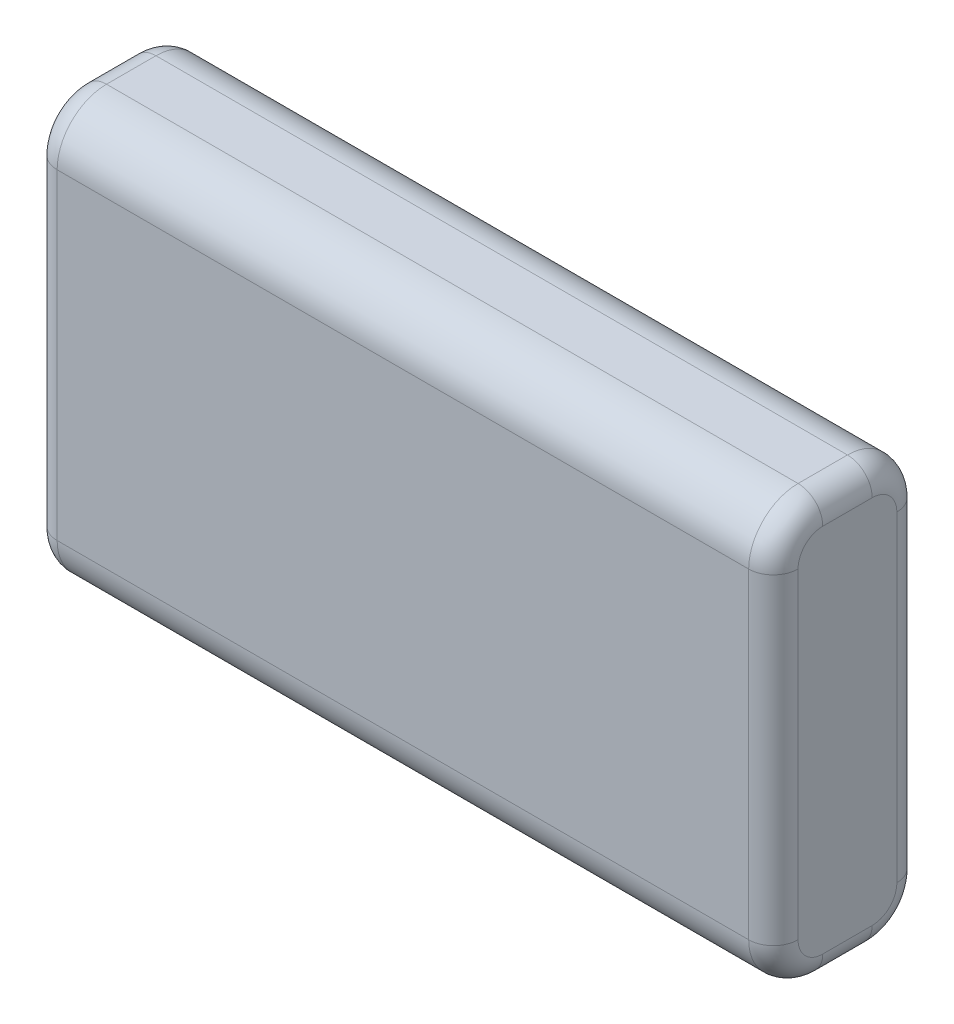
ISO-10303-21;
HEADER;
FILE_DESCRIPTION(('STEP AP214'),'2;1');
FILE_NAME('part.step','',(''),(''),'','','');
FILE_SCHEMA(('AUTOMOTIVE_DESIGN { 1 0 10303 214 1 1 1 1 }'));
ENDSEC;
DATA;
#1=APPLICATION_CONTEXT('core data for automotive mechanical design processes');
#2=APPLICATION_PROTOCOL_DEFINITION('international standard','automotive_design',2000,#1);
#3=PRODUCT_CONTEXT('',#1,'mechanical');
#4=PRODUCT('Part','Part','',(#3));
#5=PRODUCT_RELATED_PRODUCT_CATEGORY('part','',(#4));
#6=PRODUCT_DEFINITION_FORMATION('','',#4);
#7=PRODUCT_DEFINITION_CONTEXT('part definition',#1,'design');
#8=PRODUCT_DEFINITION('design','',#6,#7);
#9=PRODUCT_DEFINITION_SHAPE('','',#8);
#10=(LENGTH_UNIT() NAMED_UNIT(*) SI_UNIT(.MILLI.,.METRE.));
#11=(NAMED_UNIT(*) PLANE_ANGLE_UNIT() SI_UNIT($,.RADIAN.));
#12=(NAMED_UNIT(*) SI_UNIT($,.STERADIAN.) SOLID_ANGLE_UNIT());
#13=UNCERTAINTY_MEASURE_WITH_UNIT(LENGTH_MEASURE(1.E-05),#10,'distance_accuracy_value','');
#14=(GEOMETRIC_REPRESENTATION_CONTEXT(3) GLOBAL_UNCERTAINTY_ASSIGNED_CONTEXT((#13)) GLOBAL_UNIT_ASSIGNED_CONTEXT((#10,
#11,#12)) REPRESENTATION_CONTEXT('',''));
#15=CARTESIAN_POINT('',(0.,0.,0.));
#16=DIRECTION('',(0.,0.,1.));
#17=DIRECTION('',(1.,0.,0.));
#18=AXIS2_PLACEMENT_3D('',#15,#16,#17);
#19=CARTESIAN_POINT('',(0.,0.,6.));
#20=DIRECTION('',(1.,0.,0.));
#21=DIRECTION('',(0.,0.,-1.));
#22=AXIS2_PLACEMENT_3D('',#19,#20,#21);
#23=PLANE('',#22);
#24=DIRECTION('',(0.,-1.,0.));
#25=VECTOR('',#24,1.);
#26=CARTESIAN_POINT('',(0.,0.,5.));
#27=LINE('',#26,#25);
#28=CARTESIAN_POINT('',(0.,2.,5.));
#29=VERTEX_POINT('',#28);
#30=CARTESIAN_POINT('',(0.,15.,5.));
#31=VERTEX_POINT('',#30);
#32=EDGE_CURVE('E155',#29,#31,#27,.F.);
#33=ORIENTED_EDGE('',*,*,#32,.T.);
#34=CARTESIAN_POINT('',(0.,15.,4.));
#35=DIRECTION('',(1.,0.,0.));
#36=DIRECTION('',(0.,0.,-1.));
#37=AXIS2_PLACEMENT_3D('',#34,#35,#36);
#38=CIRCLE('',#37,1.);
#39=CARTESIAN_POINT('',(0.,16.,4.));
#40=VERTEX_POINT('',#39);
#41=EDGE_CURVE('E192',#31,#40,#38,.F.);
#42=ORIENTED_EDGE('',*,*,#41,.T.);
#43=DIRECTION('',(0.,0.,-1.));
#44=VECTOR('',#43,1.);
#45=CARTESIAN_POINT('',(0.,16.,6.));
#46=LINE('',#45,#44);
#47=CARTESIAN_POINT('',(0.,16.,2.));
#48=VERTEX_POINT('',#47);
#49=EDGE_CURVE('E190',#40,#48,#46,.T.);
#50=ORIENTED_EDGE('',*,*,#49,.T.);
#51=CARTESIAN_POINT('',(0.,15.,2.));
#52=DIRECTION('',(1.,0.,0.));
#53=DIRECTION('',(0.,0.,-1.));
#54=AXIS2_PLACEMENT_3D('',#51,#52,#53);
#55=CIRCLE('',#54,1.);
#56=CARTESIAN_POINT('',(0.,15.,1.));
#57=VERTEX_POINT('',#56);
#58=EDGE_CURVE('E188',#48,#57,#55,.F.);
#59=ORIENTED_EDGE('',*,*,#58,.T.);
#60=DIRECTION('',(0.,-1.,0.));
#61=VECTOR('',#60,1.);
#62=CARTESIAN_POINT('',(0.,2.,1.));
#63=LINE('',#62,#61);
#64=CARTESIAN_POINT('',(0.,2.,1.));
#65=VERTEX_POINT('',#64);
#66=EDGE_CURVE('E186',#57,#65,#63,.T.);
#67=ORIENTED_EDGE('',*,*,#66,.T.);
#68=CARTESIAN_POINT('',(0.,2.,2.));
#69=DIRECTION('',(1.,0.,0.));
#70=DIRECTION('',(0.,0.,-1.));
#71=AXIS2_PLACEMENT_3D('',#68,#69,#70);
#72=CIRCLE('',#71,1.);
#73=CARTESIAN_POINT('',(0.,1.,2.));
#74=VERTEX_POINT('',#73);
#75=EDGE_CURVE('E184',#65,#74,#72,.F.);
#76=ORIENTED_EDGE('',*,*,#75,.T.);
#77=DIRECTION('',(0.,0.,-1.));
#78=VECTOR('',#77,1.);
#79=CARTESIAN_POINT('',(0.,1.,6.));
#80=LINE('',#79,#78);
#81=CARTESIAN_POINT('',(0.,1.,4.));
#82=VERTEX_POINT('',#81);
#83=EDGE_CURVE('E158',#74,#82,#80,.F.);
#84=ORIENTED_EDGE('',*,*,#83,.T.);
#85=CARTESIAN_POINT('',(0.,2.,4.));
#86=DIRECTION('',(1.,0.,0.));
#87=DIRECTION('',(0.,0.,-1.));
#88=AXIS2_PLACEMENT_3D('',#85,#86,#87);
#89=CIRCLE('',#88,1.);
#90=EDGE_CURVE('E151',#82,#29,#89,.F.);
#91=ORIENTED_EDGE('',*,*,#90,.T.);
#92=EDGE_LOOP('',(#33,#42,#50,#59,#67,#76,#84,#91));
#93=FACE_BOUND('',#92,.T.);
#94=ADVANCED_FACE('F36',(#93),#23,.F.);
#95=CARTESIAN_POINT('',(0.,0.,6.));
#96=DIRECTION('',(0.,1.,0.));
#97=DIRECTION('',(0.,0.,1.));
#98=AXIS2_PLACEMENT_3D('',#95,#96,#97);
#99=PLANE('',#98);
#100=DIRECTION('',(1.,0.,0.));
#101=VECTOR('',#100,1.);
#102=CARTESIAN_POINT('',(0.,0.,4.));
#103=LINE('',#102,#101);
#104=CARTESIAN_POINT('',(29.,0.,4.));
#105=VERTEX_POINT('',#104);
#106=CARTESIAN_POINT('',(1.,0.,4.));
#107=VERTEX_POINT('',#106);
#108=EDGE_CURVE('E254',#105,#107,#103,.F.);
#109=ORIENTED_EDGE('',*,*,#108,.T.);
#110=DIRECTION('',(0.,0.,-1.));
#111=VECTOR('',#110,1.);
#112=CARTESIAN_POINT('',(1.,0.,6.));
#113=LINE('',#112,#111);
#114=CARTESIAN_POINT('',(1.,0.,2.));
#115=VERTEX_POINT('',#114);
#116=EDGE_CURVE('E217',#107,#115,#113,.T.);
#117=ORIENTED_EDGE('',*,*,#116,.T.);
#118=DIRECTION('',(1.,0.,0.));
#119=VECTOR('',#118,1.);
#120=CARTESIAN_POINT('',(30.,0.,2.));
#121=LINE('',#120,#119);
#122=CARTESIAN_POINT('',(29.,0.,2.));
#123=VERTEX_POINT('',#122);
#124=EDGE_CURVE('E299',#115,#123,#121,.T.);
#125=ORIENTED_EDGE('',*,*,#124,.T.);
#126=DIRECTION('',(0.,0.,-1.));
#127=VECTOR('',#126,1.);
#128=CARTESIAN_POINT('',(29.,0.,6.));
#129=LINE('',#128,#127);
#130=EDGE_CURVE('E215',#123,#105,#129,.F.);
#131=ORIENTED_EDGE('',*,*,#130,.T.);
#132=EDGE_LOOP('',(#109,#117,#125,#131));
#133=FACE_BOUND('',#132,.T.);
#134=ADVANCED_FACE('F365',(#133),#99,.F.);
#135=CARTESIAN_POINT('',(30.,0.,6.));
#136=DIRECTION('',(-1.,0.,0.));
#137=DIRECTION('',(0.,0.,1.));
#138=AXIS2_PLACEMENT_3D('',#135,#136,#137);
#139=PLANE('',#138);
#140=DIRECTION('',(0.,1.,0.));
#141=VECTOR('',#140,1.);
#142=CARTESIAN_POINT('',(30.,0.,5.));
#143=LINE('',#142,#141);
#144=CARTESIAN_POINT('',(30.,15.,5.));
#145=VERTEX_POINT('',#144);
#146=CARTESIAN_POINT('',(30.,2.,5.));
#147=VERTEX_POINT('',#146);
#148=EDGE_CURVE('E223',#145,#147,#143,.F.);
#149=ORIENTED_EDGE('',*,*,#148,.T.);
#150=CARTESIAN_POINT('',(30.,2.,4.));
#151=DIRECTION('',(-1.,0.,0.));
#152=DIRECTION('',(0.,0.,1.));
#153=AXIS2_PLACEMENT_3D('',#150,#151,#152);
#154=CIRCLE('',#153,1.);
#155=CARTESIAN_POINT('',(30.,1.,4.));
#156=VERTEX_POINT('',#155);
#157=EDGE_CURVE('E236',#147,#156,#154,.F.);
#158=ORIENTED_EDGE('',*,*,#157,.T.);
#159=DIRECTION('',(0.,0.,-1.));
#160=VECTOR('',#159,1.);
#161=CARTESIAN_POINT('',(30.,1.,6.));
#162=LINE('',#161,#160);
#163=CARTESIAN_POINT('',(30.,1.,2.));
#164=VERTEX_POINT('',#163);
#165=EDGE_CURVE('E60',#156,#164,#162,.T.);
#166=ORIENTED_EDGE('',*,*,#165,.T.);
#167=CARTESIAN_POINT('',(30.,2.,2.));
#168=DIRECTION('',(-1.,0.,0.));
#169=DIRECTION('',(0.,0.,1.));
#170=AXIS2_PLACEMENT_3D('',#167,#168,#169);
#171=CIRCLE('',#170,1.);
#172=CARTESIAN_POINT('',(30.,2.,1.));
#173=VERTEX_POINT('',#172);
#174=EDGE_CURVE('E233',#164,#173,#171,.F.);
#175=ORIENTED_EDGE('',*,*,#174,.T.);
#176=DIRECTION('',(0.,1.,0.));
#177=VECTOR('',#176,1.);
#178=CARTESIAN_POINT('',(30.,15.,1.));
#179=LINE('',#178,#177);
#180=CARTESIAN_POINT('',(30.,15.,1.));
#181=VERTEX_POINT('',#180);
#182=EDGE_CURVE('E231',#173,#181,#179,.T.);
#183=ORIENTED_EDGE('',*,*,#182,.T.);
#184=CARTESIAN_POINT('',(30.,15.,2.));
#185=DIRECTION('',(-1.,0.,0.));
#186=DIRECTION('',(0.,0.,1.));
#187=AXIS2_PLACEMENT_3D('',#184,#185,#186);
#188=CIRCLE('',#187,1.);
#189=CARTESIAN_POINT('',(30.,16.,2.));
#190=VERTEX_POINT('',#189);
#191=EDGE_CURVE('E229',#181,#190,#188,.F.);
#192=ORIENTED_EDGE('',*,*,#191,.T.);
#193=DIRECTION('',(0.,0.,-1.));
#194=VECTOR('',#193,1.);
#195=CARTESIAN_POINT('',(30.,16.,6.));
#196=LINE('',#195,#194);
#197=CARTESIAN_POINT('',(30.,16.,4.));
#198=VERTEX_POINT('',#197);
#199=EDGE_CURVE('E227',#190,#198,#196,.F.);
#200=ORIENTED_EDGE('',*,*,#199,.T.);
#201=CARTESIAN_POINT('',(30.,15.,4.));
#202=DIRECTION('',(-1.,0.,0.));
#203=DIRECTION('',(0.,0.,1.));
#204=AXIS2_PLACEMENT_3D('',#201,#202,#203);
#205=CIRCLE('',#204,1.);
#206=EDGE_CURVE('E225',#198,#145,#205,.F.);
#207=ORIENTED_EDGE('',*,*,#206,.T.);
#208=EDGE_LOOP('',(#149,#158,#166,#175,#183,#192,#200,#207));
#209=FACE_BOUND('',#208,.T.);
#210=ADVANCED_FACE('F349',(#209),#139,.F.);
#211=CARTESIAN_POINT('',(0.,17.,6.));
#212=DIRECTION('',(0.,-1.,0.));
#213=DIRECTION('',(0.,0.,-1.));
#214=AXIS2_PLACEMENT_3D('',#211,#212,#213);
#215=PLANE('',#214);
#216=DIRECTION('',(-1.,0.,0.));
#217=VECTOR('',#216,1.);
#218=CARTESIAN_POINT('',(0.,17.,2.));
#219=LINE('',#218,#217);
#220=CARTESIAN_POINT('',(29.,17.,2.));
#221=VERTEX_POINT('',#220);
#222=CARTESIAN_POINT('',(1.,17.,2.));
#223=VERTEX_POINT('',#222);
#224=EDGE_CURVE('E179',#221,#223,#219,.T.);
#225=ORIENTED_EDGE('',*,*,#224,.T.);
#226=DIRECTION('',(0.,0.,-1.));
#227=VECTOR('',#226,1.);
#228=CARTESIAN_POINT('',(1.,17.,6.));
#229=LINE('',#228,#227);
#230=CARTESIAN_POINT('',(1.,17.,4.));
#231=VERTEX_POINT('',#230);
#232=EDGE_CURVE('E201',#223,#231,#229,.F.);
#233=ORIENTED_EDGE('',*,*,#232,.T.);
#234=DIRECTION('',(-1.,0.,0.));
#235=VECTOR('',#234,1.);
#236=CARTESIAN_POINT('',(0.,17.,4.));
#237=LINE('',#236,#235);
#238=CARTESIAN_POINT('',(29.,17.,4.));
#239=VERTEX_POINT('',#238);
#240=EDGE_CURVE('E176',#231,#239,#237,.F.);
#241=ORIENTED_EDGE('',*,*,#240,.T.);
#242=DIRECTION('',(0.,0.,-1.));
#243=VECTOR('',#242,1.);
#244=CARTESIAN_POINT('',(29.,17.,6.));
#245=LINE('',#244,#243);
#246=EDGE_CURVE('E199',#239,#221,#245,.T.);
#247=ORIENTED_EDGE('',*,*,#246,.T.);
#248=EDGE_LOOP('',(#225,#233,#241,#247));
#249=FACE_BOUND('',#248,.T.);
#250=ADVANCED_FACE('F313',(#249),#215,.F.);
#251=CARTESIAN_POINT('',(0.,0.,6.));
#252=DIRECTION('',(0.,0.,-1.));
#253=DIRECTION('',(-1.,0.,0.));
#254=AXIS2_PLACEMENT_3D('',#251,#252,#253);
#255=PLANE('',#254);
#256=DIRECTION('',(-1.,0.,0.));
#257=VECTOR('',#256,1.);
#258=CARTESIAN_POINT('',(0.,15.,6.));
#259=LINE('',#258,#257);
#260=CARTESIAN_POINT('',(29.,15.,6.));
#261=VERTEX_POINT('',#260);
#262=CARTESIAN_POINT('',(1.,15.,6.));
#263=VERTEX_POINT('',#262);
#264=EDGE_CURVE('E301',#261,#263,#259,.T.);
#265=ORIENTED_EDGE('',*,*,#264,.T.);
#266=DIRECTION('',(0.,-1.,0.));
#267=VECTOR('',#266,1.);
#268=CARTESIAN_POINT('',(1.,0.,6.));
#269=LINE('',#268,#267);
#270=CARTESIAN_POINT('',(1.,2.,6.));
#271=VERTEX_POINT('',#270);
#272=EDGE_CURVE('E11',#263,#271,#269,.T.);
#273=ORIENTED_EDGE('',*,*,#272,.T.);
#274=DIRECTION('',(1.,0.,0.));
#275=VECTOR('',#274,1.);
#276=CARTESIAN_POINT('',(0.,2.,6.));
#277=LINE('',#276,#275);
#278=CARTESIAN_POINT('',(29.,2.,6.));
#279=VERTEX_POINT('',#278);
#280=EDGE_CURVE('E309',#271,#279,#277,.T.);
#281=ORIENTED_EDGE('',*,*,#280,.T.);
#282=DIRECTION('',(0.,1.,0.));
#283=VECTOR('',#282,1.);
#284=CARTESIAN_POINT('',(29.,0.,6.));
#285=LINE('',#284,#283);
#286=EDGE_CURVE('E45',#279,#261,#285,.T.);
#287=ORIENTED_EDGE('',*,*,#286,.T.);
#288=EDGE_LOOP('',(#265,#273,#281,#287));
#289=FACE_BOUND('',#288,.T.);
#290=ADVANCED_FACE('F332',(#289),#255,.F.);
#291=CARTESIAN_POINT('',(0.,0.,0.));
#292=DIRECTION('',(0.,0.,-1.));
#293=DIRECTION('',(-1.,0.,0.));
#294=AXIS2_PLACEMENT_3D('',#291,#292,#293);
#295=PLANE('',#294);
#296=DIRECTION('',(1.,0.,0.));
#297=VECTOR('',#296,1.);
#298=CARTESIAN_POINT('',(0.,2.,0.));
#299=LINE('',#298,#297);
#300=CARTESIAN_POINT('',(29.,2.,0.));
#301=VERTEX_POINT('',#300);
#302=CARTESIAN_POINT('',(1.,2.,0.));
#303=VERTEX_POINT('',#302);
#304=EDGE_CURVE('E298',#301,#303,#299,.F.);
#305=ORIENTED_EDGE('',*,*,#304,.T.);
#306=DIRECTION('',(0.,-1.,0.));
#307=VECTOR('',#306,1.);
#308=CARTESIAN_POINT('',(1.,15.,0.));
#309=LINE('',#308,#307);
#310=CARTESIAN_POINT('',(1.,15.,0.));
#311=VERTEX_POINT('',#310);
#312=EDGE_CURVE('E209',#303,#311,#309,.F.);
#313=ORIENTED_EDGE('',*,*,#312,.T.);
#314=DIRECTION('',(-1.,0.,0.));
#315=VECTOR('',#314,1.);
#316=CARTESIAN_POINT('',(30.,15.,0.));
#317=LINE('',#316,#315);
#318=CARTESIAN_POINT('',(29.,15.,0.));
#319=VERTEX_POINT('',#318);
#320=EDGE_CURVE('E290',#311,#319,#317,.F.);
#321=ORIENTED_EDGE('',*,*,#320,.T.);
#322=DIRECTION('',(0.,1.,0.));
#323=VECTOR('',#322,1.);
#324=CARTESIAN_POINT('',(29.,2.,0.));
#325=LINE('',#324,#323);
#326=EDGE_CURVE('E207',#319,#301,#325,.F.);
#327=ORIENTED_EDGE('',*,*,#326,.T.);
#328=EDGE_LOOP('',(#305,#313,#321,#327));
#329=FACE_BOUND('',#328,.T.);
#330=ADVANCED_FACE('F295',(#329),#295,.T.);
#331=CARTESIAN_POINT('',(0.,2.,2.));
#332=DIRECTION('',(-1.,0.,0.));
#333=DIRECTION('',(0.,0.,1.));
#334=AXIS2_PLACEMENT_3D('',#331,#332,#333);
#335=CYLINDRICAL_SURFACE('',#334,2.);
#336=ORIENTED_EDGE('',*,*,#124,.F.);
#337=CARTESIAN_POINT('',(1.,2.,2.));
#338=DIRECTION('',(1.,0.,0.));
#339=DIRECTION('',(0.,0.,-1.));
#340=AXIS2_PLACEMENT_3D('',#337,#338,#339);
#341=CIRCLE('',#340,2.);
#342=EDGE_CURVE('E213',#115,#303,#341,.T.);
#343=ORIENTED_EDGE('',*,*,#342,.T.);
#344=ORIENTED_EDGE('',*,*,#304,.F.);
#345=CARTESIAN_POINT('',(29.,2.,2.));
#346=DIRECTION('',(-1.,0.,0.));
#347=DIRECTION('',(0.,0.,1.));
#348=AXIS2_PLACEMENT_3D('',#345,#346,#347);
#349=CIRCLE('',#348,2.);
#350=EDGE_CURVE('E211',#301,#123,#349,.T.);
#351=ORIENTED_EDGE('',*,*,#350,.T.);
#352=EDGE_LOOP('',(#336,#343,#344,#351));
#353=FACE_BOUND('',#352,.T.);
#354=ADVANCED_FACE('F374',(#353),#335,.T.);
#355=CARTESIAN_POINT('',(0.,2.,4.));
#356=DIRECTION('',(1.,0.,0.));
#357=DIRECTION('',(0.,0.,-1.));
#358=AXIS2_PLACEMENT_3D('',#355,#356,#357);
#359=CYLINDRICAL_SURFACE('',#358,2.);
#360=ORIENTED_EDGE('',*,*,#280,.F.);
#361=CARTESIAN_POINT('',(1.,2.,4.));
#362=DIRECTION('',(1.,0.,0.));
#363=DIRECTION('',(0.,0.,-1.));
#364=AXIS2_PLACEMENT_3D('',#361,#362,#363);
#365=CIRCLE('',#364,2.);
#366=EDGE_CURVE('E167',#271,#107,#365,.T.);
#367=ORIENTED_EDGE('',*,*,#366,.T.);
#368=ORIENTED_EDGE('',*,*,#108,.F.);
#369=CARTESIAN_POINT('',(29.,2.,4.));
#370=DIRECTION('',(-1.,0.,0.));
#371=DIRECTION('',(0.,0.,1.));
#372=AXIS2_PLACEMENT_3D('',#369,#370,#371);
#373=CIRCLE('',#372,2.);
#374=EDGE_CURVE('E219',#105,#279,#373,.T.);
#375=ORIENTED_EDGE('',*,*,#374,.T.);
#376=EDGE_LOOP('',(#360,#367,#368,#375));
#377=FACE_BOUND('',#376,.T.);
#378=ADVANCED_FACE('F342',(#377),#359,.T.);
#379=CARTESIAN_POINT('',(0.,15.,4.));
#380=DIRECTION('',(-1.,0.,0.));
#381=DIRECTION('',(0.,0.,1.));
#382=AXIS2_PLACEMENT_3D('',#379,#380,#381);
#383=CYLINDRICAL_SURFACE('',#382,2.);
#384=ORIENTED_EDGE('',*,*,#240,.F.);
#385=CARTESIAN_POINT('',(1.,15.,4.));
#386=DIRECTION('',(1.,0.,0.));
#387=DIRECTION('',(0.,0.,-1.));
#388=AXIS2_PLACEMENT_3D('',#385,#386,#387);
#389=CIRCLE('',#388,2.);
#390=EDGE_CURVE('E196',#231,#263,#389,.T.);
#391=ORIENTED_EDGE('',*,*,#390,.T.);
#392=ORIENTED_EDGE('',*,*,#264,.F.);
#393=CARTESIAN_POINT('',(29.,15.,4.));
#394=DIRECTION('',(-1.,0.,0.));
#395=DIRECTION('',(0.,0.,1.));
#396=AXIS2_PLACEMENT_3D('',#393,#394,#395);
#397=CIRCLE('',#396,2.);
#398=EDGE_CURVE('E194',#261,#239,#397,.T.);
#399=ORIENTED_EDGE('',*,*,#398,.T.);
#400=EDGE_LOOP('',(#384,#391,#392,#399));
#401=FACE_BOUND('',#400,.T.);
#402=ADVANCED_FACE('F329',(#401),#383,.T.);
#403=CARTESIAN_POINT('',(0.,15.,2.));
#404=DIRECTION('',(1.,0.,0.));
#405=DIRECTION('',(0.,0.,-1.));
#406=AXIS2_PLACEMENT_3D('',#403,#404,#405);
#407=CYLINDRICAL_SURFACE('',#406,2.);
#408=ORIENTED_EDGE('',*,*,#320,.F.);
#409=CARTESIAN_POINT('',(1.,15.,2.));
#410=DIRECTION('',(1.,0.,0.));
#411=DIRECTION('',(0.,0.,-1.));
#412=AXIS2_PLACEMENT_3D('',#409,#410,#411);
#413=CIRCLE('',#412,2.);
#414=EDGE_CURVE('E205',#311,#223,#413,.T.);
#415=ORIENTED_EDGE('',*,*,#414,.T.);
#416=ORIENTED_EDGE('',*,*,#224,.F.);
#417=CARTESIAN_POINT('',(29.,15.,2.));
#418=DIRECTION('',(-1.,0.,0.));
#419=DIRECTION('',(0.,0.,1.));
#420=AXIS2_PLACEMENT_3D('',#417,#418,#419);
#421=CIRCLE('',#420,2.);
#422=EDGE_CURVE('E203',#221,#319,#421,.T.);
#423=ORIENTED_EDGE('',*,*,#422,.T.);
#424=EDGE_LOOP('',(#408,#415,#416,#423));
#425=FACE_BOUND('',#424,.T.);
#426=ADVANCED_FACE('F289',(#425),#407,.T.);
#427=CARTESIAN_POINT('',(1.,2.,2.));
#428=DIRECTION('',(1.,0.,0.));
#429=DIRECTION('',(0.,0.,-1.));
#430=AXIS2_PLACEMENT_3D('',#427,#428,#429);
#431=DEGENERATE_TOROIDAL_SURFACE('',#430,1.,1.,.T.);
#432=CARTESIAN_POINT('',(1.,2.,1.));
#433=DIRECTION('',(0.,1.,0.));
#434=DIRECTION('',(0.,0.,1.));
#435=AXIS2_PLACEMENT_3D('',#432,#433,#434);
#436=CIRCLE('',#435,1.);
#437=EDGE_CURVE('E248',#303,#65,#436,.T.);
#438=ORIENTED_EDGE('',*,*,#437,.F.);
#439=ORIENTED_EDGE('',*,*,#342,.F.);
#440=CARTESIAN_POINT('',(1.,1.,2.));
#441=DIRECTION('',(0.,0.,1.));
#442=DIRECTION('',(1.,0.,0.));
#443=AXIS2_PLACEMENT_3D('',#440,#441,#442);
#444=CIRCLE('',#443,1.);
#445=EDGE_CURVE('E251',#74,#115,#444,.T.);
#446=ORIENTED_EDGE('',*,*,#445,.F.);
#447=ORIENTED_EDGE('',*,*,#75,.F.);
#448=EDGE_LOOP('',(#438,#439,#446,#447));
#449=FACE_BOUND('',#448,.T.);
#450=ADVANCED_FACE('F384',(#449),#431,.T.);
#451=CARTESIAN_POINT('',(1.,1.,6.));
#452=DIRECTION('',(0.,0.,-1.));
#453=DIRECTION('',(-1.,0.,0.));
#454=AXIS2_PLACEMENT_3D('',#451,#452,#453);
#455=CYLINDRICAL_SURFACE('',#454,1.);
#456=ORIENTED_EDGE('',*,*,#445,.T.);
#457=ORIENTED_EDGE('',*,*,#116,.F.);
#458=CARTESIAN_POINT('',(1.,1.,4.));
#459=DIRECTION('',(0.,0.,1.));
#460=DIRECTION('',(1.,0.,0.));
#461=AXIS2_PLACEMENT_3D('',#458,#459,#460);
#462=CIRCLE('',#461,1.);
#463=EDGE_CURVE('E246',#82,#107,#462,.T.);
#464=ORIENTED_EDGE('',*,*,#463,.F.);
#465=ORIENTED_EDGE('',*,*,#83,.F.);
#466=EDGE_LOOP('',(#456,#457,#464,#465));
#467=FACE_BOUND('',#466,.T.);
#468=ADVANCED_FACE('F398',(#467),#455,.T.);
#469=CARTESIAN_POINT('',(1.,0.,1.));
#470=DIRECTION('',(0.,1.,0.));
#471=DIRECTION('',(0.,0.,1.));
#472=AXIS2_PLACEMENT_3D('',#469,#470,#471);
#473=CYLINDRICAL_SURFACE('',#472,1.);
#474=ORIENTED_EDGE('',*,*,#437,.T.);
#475=ORIENTED_EDGE('',*,*,#66,.F.);
#476=CARTESIAN_POINT('',(1.,15.,1.));
#477=DIRECTION('',(0.,1.,0.));
#478=DIRECTION('',(0.,0.,1.));
#479=AXIS2_PLACEMENT_3D('',#476,#477,#478);
#480=CIRCLE('',#479,1.);
#481=EDGE_CURVE('E170',#311,#57,#480,.T.);
#482=ORIENTED_EDGE('',*,*,#481,.F.);
#483=ORIENTED_EDGE('',*,*,#312,.F.);
#484=EDGE_LOOP('',(#474,#475,#482,#483));
#485=FACE_BOUND('',#484,.T.);
#486=ADVANCED_FACE('F395',(#485),#473,.T.);
#487=CARTESIAN_POINT('',(1.,2.,4.));
#488=DIRECTION('',(1.,0.,0.));
#489=DIRECTION('',(0.,0.,-1.));
#490=AXIS2_PLACEMENT_3D('',#487,#488,#489);
#491=DEGENERATE_TOROIDAL_SURFACE('',#490,1.,1.,.T.);
#492=ORIENTED_EDGE('',*,*,#463,.T.);
#493=ORIENTED_EDGE('',*,*,#366,.F.);
#494=CARTESIAN_POINT('',(1.,2.,5.));
#495=DIRECTION('',(0.,1.,0.));
#496=DIRECTION('',(0.,0.,1.));
#497=AXIS2_PLACEMENT_3D('',#494,#495,#496);
#498=CIRCLE('',#497,1.);
#499=EDGE_CURVE('E165',#29,#271,#498,.T.);
#500=ORIENTED_EDGE('',*,*,#499,.F.);
#501=ORIENTED_EDGE('',*,*,#90,.F.);
#502=EDGE_LOOP('',(#492,#493,#500,#501));
#503=FACE_BOUND('',#502,.T.);
#504=ADVANCED_FACE('F166',(#503),#491,.T.);
#505=CARTESIAN_POINT('',(1.,15.,2.));
#506=DIRECTION('',(1.,0.,0.));
#507=DIRECTION('',(0.,0.,-1.));
#508=AXIS2_PLACEMENT_3D('',#505,#506,#507);
#509=DEGENERATE_TOROIDAL_SURFACE('',#508,1.,1.,.T.);
#510=ORIENTED_EDGE('',*,*,#481,.T.);
#511=ORIENTED_EDGE('',*,*,#58,.F.);
#512=CARTESIAN_POINT('',(1.,16.,2.));
#513=DIRECTION('',(0.,0.,1.));
#514=DIRECTION('',(1.,0.,0.));
#515=AXIS2_PLACEMENT_3D('',#512,#513,#514);
#516=CIRCLE('',#515,1.);
#517=EDGE_CURVE('E171',#223,#48,#516,.T.);
#518=ORIENTED_EDGE('',*,*,#517,.F.);
#519=ORIENTED_EDGE('',*,*,#414,.F.);
#520=EDGE_LOOP('',(#510,#511,#518,#519));
#521=FACE_BOUND('',#520,.T.);
#522=ADVANCED_FACE('F319',(#521),#509,.T.);
#523=CARTESIAN_POINT('',(1.,0.,5.));
#524=DIRECTION('',(0.,-1.,0.));
#525=DIRECTION('',(0.,0.,-1.));
#526=AXIS2_PLACEMENT_3D('',#523,#524,#525);
#527=CYLINDRICAL_SURFACE('',#526,1.);
#528=ORIENTED_EDGE('',*,*,#499,.T.);
#529=ORIENTED_EDGE('',*,*,#272,.F.);
#530=CARTESIAN_POINT('',(1.,15.,5.));
#531=DIRECTION('',(0.,1.,0.));
#532=DIRECTION('',(0.,0.,1.));
#533=AXIS2_PLACEMENT_3D('',#530,#531,#532);
#534=CIRCLE('',#533,1.);
#535=EDGE_CURVE('E174',#31,#263,#534,.T.);
#536=ORIENTED_EDGE('',*,*,#535,.F.);
#537=ORIENTED_EDGE('',*,*,#32,.F.);
#538=EDGE_LOOP('',(#528,#529,#536,#537));
#539=FACE_BOUND('',#538,.T.);
#540=ADVANCED_FACE('F173',(#539),#527,.T.);
#541=CARTESIAN_POINT('',(1.,16.,6.));
#542=DIRECTION('',(0.,0.,-1.));
#543=DIRECTION('',(-1.,0.,0.));
#544=AXIS2_PLACEMENT_3D('',#541,#542,#543);
#545=CYLINDRICAL_SURFACE('',#544,1.);
#546=ORIENTED_EDGE('',*,*,#517,.T.);
#547=ORIENTED_EDGE('',*,*,#49,.F.);
#548=CARTESIAN_POINT('',(1.,16.,4.));
#549=DIRECTION('',(0.,0.,1.));
#550=DIRECTION('',(1.,0.,0.));
#551=AXIS2_PLACEMENT_3D('',#548,#549,#550);
#552=CIRCLE('',#551,1.);
#553=EDGE_CURVE('E239',#231,#40,#552,.T.);
#554=ORIENTED_EDGE('',*,*,#553,.F.);
#555=ORIENTED_EDGE('',*,*,#232,.F.);
#556=EDGE_LOOP('',(#546,#547,#554,#555));
#557=FACE_BOUND('',#556,.T.);
#558=ADVANCED_FACE('F323',(#557),#545,.T.);
#559=CARTESIAN_POINT('',(1.,15.,4.));
#560=DIRECTION('',(1.,0.,0.));
#561=DIRECTION('',(0.,0.,-1.));
#562=AXIS2_PLACEMENT_3D('',#559,#560,#561);
#563=DEGENERATE_TOROIDAL_SURFACE('',#562,1.,1.,.T.);
#564=ORIENTED_EDGE('',*,*,#535,.T.);
#565=ORIENTED_EDGE('',*,*,#390,.F.);
#566=ORIENTED_EDGE('',*,*,#553,.T.);
#567=ORIENTED_EDGE('',*,*,#41,.F.);
#568=EDGE_LOOP('',(#564,#565,#566,#567));
#569=FACE_BOUND('',#568,.T.);
#570=ADVANCED_FACE('F326',(#569),#563,.T.);
#571=CARTESIAN_POINT('',(29.,15.,2.));
#572=DIRECTION('',(-1.,0.,0.));
#573=DIRECTION('',(0.,0.,1.));
#574=AXIS2_PLACEMENT_3D('',#571,#572,#573);
#575=DEGENERATE_TOROIDAL_SURFACE('',#574,1.,1.,.T.);
#576=CARTESIAN_POINT('',(29.,15.,1.));
#577=DIRECTION('',(0.,-1.,0.));
#578=DIRECTION('',(0.,0.,-1.));
#579=AXIS2_PLACEMENT_3D('',#576,#577,#578);
#580=CIRCLE('',#579,1.);
#581=EDGE_CURVE('E269',#319,#181,#580,.T.);
#582=ORIENTED_EDGE('',*,*,#581,.F.);
#583=ORIENTED_EDGE('',*,*,#422,.F.);
#584=CARTESIAN_POINT('',(29.,16.,2.));
#585=DIRECTION('',(0.,0.,1.));
#586=DIRECTION('',(1.,0.,0.));
#587=AXIS2_PLACEMENT_3D('',#584,#585,#586);
#588=CIRCLE('',#587,1.);
#589=EDGE_CURVE('E40',#190,#221,#588,.T.);
#590=ORIENTED_EDGE('',*,*,#589,.F.);
#591=ORIENTED_EDGE('',*,*,#191,.F.);
#592=EDGE_LOOP('',(#582,#583,#590,#591));
#593=FACE_BOUND('',#592,.T.);
#594=ADVANCED_FACE('F38',(#593),#575,.T.);
#595=CARTESIAN_POINT('',(29.,16.,6.));
#596=DIRECTION('',(0.,0.,-1.));
#597=DIRECTION('',(-1.,0.,0.));
#598=AXIS2_PLACEMENT_3D('',#595,#596,#597);
#599=CYLINDRICAL_SURFACE('',#598,1.);
#600=ORIENTED_EDGE('',*,*,#589,.T.);
#601=ORIENTED_EDGE('',*,*,#246,.F.);
#602=CARTESIAN_POINT('',(29.,16.,4.));
#603=DIRECTION('',(0.,0.,1.));
#604=DIRECTION('',(1.,0.,0.));
#605=AXIS2_PLACEMENT_3D('',#602,#603,#604);
#606=CIRCLE('',#605,1.);
#607=EDGE_CURVE('E267',#198,#239,#606,.T.);
#608=ORIENTED_EDGE('',*,*,#607,.F.);
#609=ORIENTED_EDGE('',*,*,#199,.F.);
#610=EDGE_LOOP('',(#600,#601,#608,#609));
#611=FACE_BOUND('',#610,.T.);
#612=ADVANCED_FACE('F280',(#611),#599,.T.);
#613=CARTESIAN_POINT('',(29.,0.,1.));
#614=DIRECTION('',(0.,-1.,0.));
#615=DIRECTION('',(0.,0.,-1.));
#616=AXIS2_PLACEMENT_3D('',#613,#614,#615);
#617=CYLINDRICAL_SURFACE('',#616,1.);
#618=ORIENTED_EDGE('',*,*,#581,.T.);
#619=ORIENTED_EDGE('',*,*,#182,.F.);
#620=CARTESIAN_POINT('',(29.,2.,1.));
#621=DIRECTION('',(0.,-1.,0.));
#622=DIRECTION('',(0.,0.,-1.));
#623=AXIS2_PLACEMENT_3D('',#620,#621,#622);
#624=CIRCLE('',#623,1.);
#625=EDGE_CURVE('E264',#301,#173,#624,.T.);
#626=ORIENTED_EDGE('',*,*,#625,.F.);
#627=ORIENTED_EDGE('',*,*,#326,.F.);
#628=EDGE_LOOP('',(#618,#619,#626,#627));
#629=FACE_BOUND('',#628,.T.);
#630=ADVANCED_FACE('F355',(#629),#617,.T.);
#631=CARTESIAN_POINT('',(29.,15.,4.));
#632=DIRECTION('',(-1.,0.,0.));
#633=DIRECTION('',(0.,0.,1.));
#634=AXIS2_PLACEMENT_3D('',#631,#632,#633);
#635=DEGENERATE_TOROIDAL_SURFACE('',#634,1.,1.,.T.);
#636=ORIENTED_EDGE('',*,*,#607,.T.);
#637=ORIENTED_EDGE('',*,*,#398,.F.);
#638=CARTESIAN_POINT('',(29.,15.,5.));
#639=DIRECTION('',(0.,-1.,0.));
#640=DIRECTION('',(0.,0.,-1.));
#641=AXIS2_PLACEMENT_3D('',#638,#639,#640);
#642=CIRCLE('',#641,1.);
#643=EDGE_CURVE('E261',#145,#261,#642,.T.);
#644=ORIENTED_EDGE('',*,*,#643,.F.);
#645=ORIENTED_EDGE('',*,*,#206,.F.);
#646=EDGE_LOOP('',(#636,#637,#644,#645));
#647=FACE_BOUND('',#646,.T.);
#648=ADVANCED_FACE('F352',(#647),#635,.T.);
#649=CARTESIAN_POINT('',(29.,2.,2.));
#650=DIRECTION('',(-1.,0.,0.));
#651=DIRECTION('',(0.,0.,1.));
#652=AXIS2_PLACEMENT_3D('',#649,#650,#651);
#653=DEGENERATE_TOROIDAL_SURFACE('',#652,1.,1.,.T.);
#654=ORIENTED_EDGE('',*,*,#625,.T.);
#655=ORIENTED_EDGE('',*,*,#174,.F.);
#656=CARTESIAN_POINT('',(29.,1.,2.));
#657=DIRECTION('',(0.,0.,1.));
#658=DIRECTION('',(1.,0.,0.));
#659=AXIS2_PLACEMENT_3D('',#656,#657,#658);
#660=CIRCLE('',#659,1.);
#661=EDGE_CURVE('E258',#123,#164,#660,.T.);
#662=ORIENTED_EDGE('',*,*,#661,.F.);
#663=ORIENTED_EDGE('',*,*,#350,.F.);
#664=EDGE_LOOP('',(#654,#655,#662,#663));
#665=FACE_BOUND('',#664,.T.);
#666=ADVANCED_FACE('F354',(#665),#653,.T.);
#667=CARTESIAN_POINT('',(29.,0.,5.));
#668=DIRECTION('',(0.,1.,0.));
#669=DIRECTION('',(0.,0.,1.));
#670=AXIS2_PLACEMENT_3D('',#667,#668,#669);
#671=CYLINDRICAL_SURFACE('',#670,1.);
#672=ORIENTED_EDGE('',*,*,#643,.T.);
#673=ORIENTED_EDGE('',*,*,#286,.F.);
#674=CARTESIAN_POINT('',(29.,2.,5.));
#675=DIRECTION('',(0.,-1.,0.));
#676=DIRECTION('',(0.,0.,-1.));
#677=AXIS2_PLACEMENT_3D('',#674,#675,#676);
#678=CIRCLE('',#677,1.);
#679=EDGE_CURVE('E256',#147,#279,#678,.T.);
#680=ORIENTED_EDGE('',*,*,#679,.F.);
#681=ORIENTED_EDGE('',*,*,#148,.F.);
#682=EDGE_LOOP('',(#672,#673,#680,#681));
#683=FACE_BOUND('',#682,.T.);
#684=ADVANCED_FACE('F337',(#683),#671,.T.);
#685=CARTESIAN_POINT('',(29.,1.,6.));
#686=DIRECTION('',(0.,0.,-1.));
#687=DIRECTION('',(-1.,0.,0.));
#688=AXIS2_PLACEMENT_3D('',#685,#686,#687);
#689=CYLINDRICAL_SURFACE('',#688,1.);
#690=ORIENTED_EDGE('',*,*,#661,.T.);
#691=ORIENTED_EDGE('',*,*,#165,.F.);
#692=CARTESIAN_POINT('',(29.,1.,4.));
#693=DIRECTION('',(0.,0.,1.));
#694=DIRECTION('',(1.,0.,0.));
#695=AXIS2_PLACEMENT_3D('',#692,#693,#694);
#696=CIRCLE('',#695,1.);
#697=EDGE_CURVE('E53',#105,#156,#696,.T.);
#698=ORIENTED_EDGE('',*,*,#697,.F.);
#699=ORIENTED_EDGE('',*,*,#130,.F.);
#700=EDGE_LOOP('',(#690,#691,#698,#699));
#701=FACE_BOUND('',#700,.T.);
#702=ADVANCED_FACE('F347',(#701),#689,.T.);
#703=CARTESIAN_POINT('',(29.,2.,4.));
#704=DIRECTION('',(-1.,0.,0.));
#705=DIRECTION('',(0.,0.,1.));
#706=AXIS2_PLACEMENT_3D('',#703,#704,#705);
#707=DEGENERATE_TOROIDAL_SURFACE('',#706,1.,1.,.T.);
#708=ORIENTED_EDGE('',*,*,#679,.T.);
#709=ORIENTED_EDGE('',*,*,#374,.F.);
#710=ORIENTED_EDGE('',*,*,#697,.T.);
#711=ORIENTED_EDGE('',*,*,#157,.F.);
#712=EDGE_LOOP('',(#708,#709,#710,#711));
#713=FACE_BOUND('',#712,.T.);
#714=ADVANCED_FACE('F344',(#713),#707,.T.);
#715=CLOSED_SHELL('',(#94,#134,#210,#250,#290,#330,#354,#378,#402,#426,#450,#468,#486,#504,#522,
#540,#558,#570,#594,#612,#630,#648,#666,#684,#702,#714));
#716=MANIFOLD_SOLID_BREP('B2',#715);
#717=ADVANCED_BREP_SHAPE_REPRESENTATION('',(#18,#716),#14);
#718=SHAPE_DEFINITION_REPRESENTATION(#9,#717);
ENDSEC;
END-ISO-10303-21;
